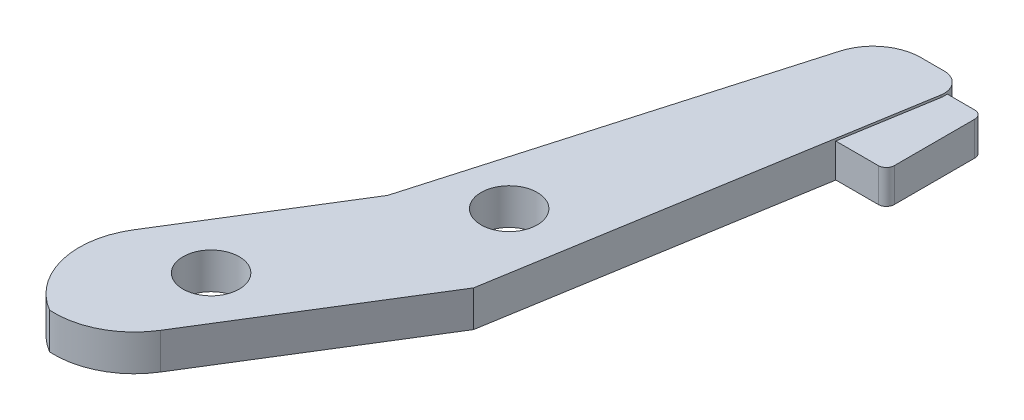
ISO-10303-21;
HEADER;
FILE_DESCRIPTION(('STEP AP214'),'2;1');
FILE_NAME('part.step','',(''),(''),'','','');
FILE_SCHEMA(('AUTOMOTIVE_DESIGN { 1 0 10303 214 1 1 1 1 }'));
ENDSEC;
DATA;
#1=APPLICATION_CONTEXT('core data for automotive mechanical design processes');
#2=APPLICATION_PROTOCOL_DEFINITION('international standard','automotive_design',2000,#1);
#3=PRODUCT_CONTEXT('',#1,'mechanical');
#4=PRODUCT('Part','Part','',(#3));
#5=PRODUCT_RELATED_PRODUCT_CATEGORY('part','',(#4));
#6=PRODUCT_DEFINITION_FORMATION('','',#4);
#7=PRODUCT_DEFINITION_CONTEXT('part definition',#1,'design');
#8=PRODUCT_DEFINITION('design','',#6,#7);
#9=PRODUCT_DEFINITION_SHAPE('','',#8);
#10=(LENGTH_UNIT() NAMED_UNIT(*) SI_UNIT(.MILLI.,.METRE.));
#11=(NAMED_UNIT(*) PLANE_ANGLE_UNIT() SI_UNIT($,.RADIAN.));
#12=(NAMED_UNIT(*) SI_UNIT($,.STERADIAN.) SOLID_ANGLE_UNIT());
#13=UNCERTAINTY_MEASURE_WITH_UNIT(LENGTH_MEASURE(1.E-05),#10,'distance_accuracy_value','');
#14=(GEOMETRIC_REPRESENTATION_CONTEXT(3) GLOBAL_UNCERTAINTY_ASSIGNED_CONTEXT((#13)) GLOBAL_UNIT_ASSIGNED_CONTEXT((#10,
#11,#12)) REPRESENTATION_CONTEXT('',''));
#15=CARTESIAN_POINT('',(0.,0.,0.));
#16=DIRECTION('',(0.,0.,1.));
#17=DIRECTION('',(1.,0.,0.));
#18=AXIS2_PLACEMENT_3D('',#15,#16,#17);
#19=CARTESIAN_POINT('',(17.140904696747,2.25,-12.9920484404567));
#20=DIRECTION('',(-0.85003009663462,0.,-0.526734121559767));
#21=DIRECTION('',(-0.526734121559767,0.,0.85003009663462));
#22=AXIS2_PLACEMENT_3D('',#19,#20,#21);
#23=PLANE('',#22);
#24=DIRECTION('',(0.526734121559767,0.,-0.85003009663462));
#25=VECTOR('',#24,1.);
#26=CARTESIAN_POINT('',(17.140904696747,2.25,-12.9920484404567));
#27=LINE('',#26,#25);
#28=CARTESIAN_POINT('',(9.68009535494014,2.25,-0.951984533055313));
#29=VERTEX_POINT('',#28);
#30=CARTESIAN_POINT('',(17.140904696747,2.25,-12.9920484404567));
#31=VERTEX_POINT('',#30);
#32=EDGE_CURVE('E188',#29,#31,#27,.T.);
#33=ORIENTED_EDGE('',*,*,#32,.F.);
#34=DIRECTION('',(0.,-1.,0.));
#35=VECTOR('',#34,1.);
#36=CARTESIAN_POINT('',(9.68009535494014,2.25,-0.951984533055313));
#37=LINE('',#36,#35);
#38=CARTESIAN_POINT('',(9.68009535494014,0.,-0.951984533055313));
#39=VERTEX_POINT('',#38);
#40=EDGE_CURVE('E217',#29,#39,#37,.T.);
#41=ORIENTED_EDGE('',*,*,#40,.T.);
#42=DIRECTION('',(0.526734121559767,0.,-0.85003009663462));
#43=VECTOR('',#42,1.);
#44=CARTESIAN_POINT('',(17.140904696747,0.,-12.9920484404567));
#45=LINE('',#44,#43);
#46=CARTESIAN_POINT('',(17.140904696747,0.,-12.9920484404567));
#47=VERTEX_POINT('',#46);
#48=EDGE_CURVE('E202',#39,#47,#45,.T.);
#49=ORIENTED_EDGE('',*,*,#48,.T.);
#50=DIRECTION('',(0.,-1.,0.));
#51=VECTOR('',#50,1.);
#52=CARTESIAN_POINT('',(17.140904696747,2.25,-12.9920484404567));
#53=LINE('',#52,#51);
#54=EDGE_CURVE('E214',#31,#47,#53,.T.);
#55=ORIENTED_EDGE('',*,*,#54,.F.);
#56=EDGE_LOOP('',(#33,#41,#49,#55));
#57=FACE_BOUND('',#56,.T.);
#58=ADVANCED_FACE('F33',(#57),#23,.F.);
#59=CARTESIAN_POINT('',(17.140904696747,2.25,-12.9920484404567));
#60=DIRECTION('',(-0.986470372828979,0.,-0.163939633800539));
#61=DIRECTION('',(-0.163939633800539,0.,0.986470372828979));
#62=AXIS2_PLACEMENT_3D('',#59,#60,#61);
#63=PLANE('',#62);
#64=DIRECTION('',(0.163939633800539,0.,-0.986470372828979));
#65=VECTOR('',#64,1.);
#66=CARTESIAN_POINT('',(17.140904696747,0.,-12.9920484404567));
#67=LINE('',#66,#65);
#68=CARTESIAN_POINT('',(21.284682724724,0.,-37.92631333672));
#69=VERTEX_POINT('',#68);
#70=EDGE_CURVE('E204',#47,#69,#67,.T.);
#71=ORIENTED_EDGE('',*,*,#70,.T.);
#72=DIRECTION('',(0.,-1.,0.));
#73=VECTOR('',#72,1.);
#74=CARTESIAN_POINT('',(21.284682724724,2.25,-37.92631333672));
#75=LINE('',#74,#73);
#76=CARTESIAN_POINT('',(21.284682724724,0.00721704735230167,-37.92631333672));
#77=VERTEX_POINT('',#76);
#78=EDGE_CURVE('E250',#69,#77,#75,.F.);
#79=ORIENTED_EDGE('',*,*,#78,.T.);
#80=DIRECTION('',(0.163939633800539,0.,-0.986470372828979));
#81=VECTOR('',#80,1.);
#82=CARTESIAN_POINT('',(21.1641785698379,0.00721704735230167,-37.201206321155));
#83=LINE('',#82,#81);
#84=CARTESIAN_POINT('',(20.3524700800733,0.00721704735230167,-32.3169305791417));
#85=VERTEX_POINT('',#84);
#86=EDGE_CURVE('E164',#85,#77,#83,.T.);
#87=ORIENTED_EDGE('',*,*,#86,.F.);
#88=DIRECTION('',(0.,-1.,0.));
#89=VECTOR('',#88,1.);
#90=CARTESIAN_POINT('',(20.3524700800733,2.1072170473523,-32.3169305791417));
#91=LINE('',#90,#89);
#92=CARTESIAN_POINT('',(20.3524700800733,2.1072170473523,-32.3169305791417));
#93=VERTEX_POINT('',#92);
#94=EDGE_CURVE('E158',#93,#85,#91,.T.);
#95=ORIENTED_EDGE('',*,*,#94,.F.);
#96=DIRECTION('',(-0.163939633800539,0.,0.986470372828979));
#97=VECTOR('',#96,1.);
#98=CARTESIAN_POINT('',(21.1641785698379,2.1072170473523,-37.201206321155));
#99=LINE('',#98,#97);
#100=CARTESIAN_POINT('',(21.284682724724,2.1072170473523,-37.92631333672));
#101=VERTEX_POINT('',#100);
#102=EDGE_CURVE('E145',#101,#93,#99,.T.);
#103=ORIENTED_EDGE('',*,*,#102,.F.);
#104=DIRECTION('',(0.,-1.,0.));
#105=VECTOR('',#104,1.);
#106=CARTESIAN_POINT('',(21.284682724724,2.25,-37.92631333672));
#107=LINE('',#106,#105);
#108=CARTESIAN_POINT('',(21.284682724724,2.25,-37.92631333672));
#109=VERTEX_POINT('',#108);
#110=EDGE_CURVE('E248',#101,#109,#107,.F.);
#111=ORIENTED_EDGE('',*,*,#110,.T.);
#112=DIRECTION('',(0.163939633800539,0.,-0.986470372828979));
#113=VECTOR('',#112,1.);
#114=CARTESIAN_POINT('',(17.140904696747,2.25,-12.9920484404567));
#115=LINE('',#114,#113);
#116=EDGE_CURVE('E190',#31,#109,#115,.T.);
#117=ORIENTED_EDGE('',*,*,#116,.F.);
#118=ORIENTED_EDGE('',*,*,#54,.T.);
#119=EDGE_LOOP('',(#71,#79,#87,#95,#103,#111,#117,#118));
#120=FACE_BOUND('',#119,.T.);
#121=ADVANCED_FACE('F162',(#120),#63,.F.);
#122=CARTESIAN_POINT('',(21.5168022197482,2.25,-39.3230408972806));
#123=DIRECTION('',(0.,0.,1.));
#124=DIRECTION('',(1.,0.,0.));
#125=AXIS2_PLACEMENT_3D('',#122,#123,#124);
#126=PLANE('',#125);
#127=DIRECTION('',(-1.,0.,0.));
#128=VECTOR('',#127,1.);
#129=CARTESIAN_POINT('',(21.5168022197482,2.25,-39.3230408972806));
#130=LINE('',#129,#128);
#131=CARTESIAN_POINT('',(20.1009182773292,2.25,-39.3230408972806));
#132=VERTEX_POINT('',#131);
#133=CARTESIAN_POINT('',(18.6611922487619,2.25,-39.3230408972806));
#134=VERTEX_POINT('',#133);
#135=EDGE_CURVE('E194',#132,#134,#130,.T.);
#136=ORIENTED_EDGE('',*,*,#135,.F.);
#137=DIRECTION('',(0.,-1.,0.));
#138=VECTOR('',#137,1.);
#139=CARTESIAN_POINT('',(20.1009182773292,2.25,-39.3230408972806));
#140=LINE('',#139,#138);
#141=CARTESIAN_POINT('',(20.1009182773292,0.,-39.3230408972806));
#142=VERTEX_POINT('',#141);
#143=EDGE_CURVE('E243',#132,#142,#140,.T.);
#144=ORIENTED_EDGE('',*,*,#143,.T.);
#145=DIRECTION('',(-1.,0.,0.));
#146=VECTOR('',#145,1.);
#147=CARTESIAN_POINT('',(21.5168022197482,0.,-39.3230408972806));
#148=LINE('',#147,#146);
#149=CARTESIAN_POINT('',(18.6611922487619,0.,-39.3230408972806));
#150=VERTEX_POINT('',#149);
#151=EDGE_CURVE('E206',#142,#150,#148,.T.);
#152=ORIENTED_EDGE('',*,*,#151,.T.);
#153=DIRECTION('',(0.,-1.,0.));
#154=VECTOR('',#153,1.);
#155=CARTESIAN_POINT('',(18.6611922487619,2.25,-39.3230408972806));
#156=LINE('',#155,#154);
#157=EDGE_CURVE('E238',#150,#134,#156,.F.);
#158=ORIENTED_EDGE('',*,*,#157,.T.);
#159=EDGE_LOOP('',(#136,#144,#152,#158));
#160=FACE_BOUND('',#159,.T.);
#161=ADVANCED_FACE('F313',(#160),#126,.F.);
#162=CARTESIAN_POINT('',(9.48121418807581,2.25,-15.3005417394231));
#163=DIRECTION('',(0.960899966314299,0.,0.276895747055058));
#164=DIRECTION('',(0.276895747055058,0.,-0.960899966314299));
#165=AXIS2_PLACEMENT_3D('',#162,#163,#164);
#166=PLANE('',#165);
#167=DIRECTION('',(-0.276895747055058,0.,0.960899966314299));
#168=VECTOR('',#167,1.);
#169=CARTESIAN_POINT('',(9.48121418807581,2.25,-15.3005417394231));
#170=LINE('',#169,#168);
#171=CARTESIAN_POINT('',(15.778492349819,2.25,-37.1537281384458));
#172=VERTEX_POINT('',#171);
#173=CARTESIAN_POINT('',(9.48121418807581,2.25,-15.3005417394231));
#174=VERTEX_POINT('',#173);
#175=EDGE_CURVE('E196',#172,#174,#170,.T.);
#176=ORIENTED_EDGE('',*,*,#175,.F.);
#177=DIRECTION('',(0.,-1.,0.));
#178=VECTOR('',#177,1.);
#179=CARTESIAN_POINT('',(15.778492349819,2.25,-37.1537281384458));
#180=LINE('',#179,#178);
#181=CARTESIAN_POINT('',(15.778492349819,0.,-37.1537281384458));
#182=VERTEX_POINT('',#181);
#183=EDGE_CURVE('E230',#172,#182,#180,.T.);
#184=ORIENTED_EDGE('',*,*,#183,.T.);
#185=DIRECTION('',(-0.276895747055058,0.,0.960899966314299));
#186=VECTOR('',#185,1.);
#187=CARTESIAN_POINT('',(9.48121418807581,0.,-15.3005417394231));
#188=LINE('',#187,#186);
#189=CARTESIAN_POINT('',(9.48121418807581,0.,-15.3005417394231));
#190=VERTEX_POINT('',#189);
#191=EDGE_CURVE('E208',#182,#190,#188,.T.);
#192=ORIENTED_EDGE('',*,*,#191,.T.);
#193=DIRECTION('',(0.,-1.,0.));
#194=VECTOR('',#193,1.);
#195=CARTESIAN_POINT('',(9.48121418807581,2.25,-15.3005417394231));
#196=LINE('',#195,#194);
#197=EDGE_CURVE('E201',#174,#190,#196,.T.);
#198=ORIENTED_EDGE('',*,*,#197,.F.);
#199=EDGE_LOOP('',(#176,#184,#192,#198));
#200=FACE_BOUND('',#199,.T.);
#201=ADVANCED_FACE('F321',(#200),#166,.F.);
#202=CARTESIAN_POINT('',(0.,2.25,0.));
#203=DIRECTION('',(0.850030096634619,0.,0.526734121559767));
#204=DIRECTION('',(0.526734121559767,0.,-0.850030096634619));
#205=AXIS2_PLACEMENT_3D('',#202,#203,#204);
#206=PLANE('',#205);
#207=DIRECTION('',(-0.526734121559767,0.,0.850030096634619));
#208=VECTOR('',#207,1.);
#209=CARTESIAN_POINT('',(0.,0.,0.));
#210=LINE('',#209,#208);
#211=CARTESIAN_POINT('',(3.43308465290625,0.,-5.54022448863435));
#212=VERTEX_POINT('',#211);
#213=EDGE_CURVE('E191',#190,#212,#210,.T.);
#214=ORIENTED_EDGE('',*,*,#213,.T.);
#215=DIRECTION('',(0.,-1.,0.));
#216=VECTOR('',#215,1.);
#217=CARTESIAN_POINT('',(3.43308465290625,2.25,-5.54022448863435));
#218=LINE('',#217,#216);
#219=CARTESIAN_POINT('',(3.43308465290625,2.25,-5.54022448863435));
#220=VERTEX_POINT('',#219);
#221=EDGE_CURVE('E228',#212,#220,#218,.F.);
#222=ORIENTED_EDGE('',*,*,#221,.T.);
#223=DIRECTION('',(-0.526734121559767,0.,0.850030096634619));
#224=VECTOR('',#223,1.);
#225=CARTESIAN_POINT('',(0.,2.25,0.));
#226=LINE('',#225,#224);
#227=EDGE_CURVE('E198',#174,#220,#226,.T.);
#228=ORIENTED_EDGE('',*,*,#227,.F.);
#229=ORIENTED_EDGE('',*,*,#197,.T.);
#230=EDGE_LOOP('',(#214,#222,#228,#229));
#231=FACE_BOUND('',#230,.T.);
#232=ADVANCED_FACE('F327',(#231),#206,.F.);
#233=CARTESIAN_POINT('',(0.,2.25,0.));
#234=DIRECTION('',(0.,-1.,0.));
#235=DIRECTION('',(0.,0.,-1.));
#236=AXIS2_PLACEMENT_3D('',#233,#234,#235);
#237=PLANE('',#236);
#238=CARTESIAN_POINT('',(8.16721187147033,2.25,-5.62987306447002));
#239=DIRECTION('',(0.,1.,0.));
#240=DIRECTION('',(0.,0.,1.));
#241=AXIS2_PLACEMENT_3D('',#238,#239,#240);
#242=CIRCLE('',#241,1.75);
#243=CARTESIAN_POINT('',(8.16721187147033,2.25,-3.87987306447002));
#244=VERTEX_POINT('',#243);
#245=EDGE_CURVE('E180',#244,#244,#242,.T.);
#246=ORIENTED_EDGE('',*,*,#245,.F.);
#247=EDGE_LOOP('',(#246));
#248=FACE_BOUND('',#247,.T.);
#249=CARTESIAN_POINT('',(13.9792075582931,2.25,-18.3664623306885));
#250=DIRECTION('',(0.,1.,0.));
#251=DIRECTION('',(0.,0.,1.));
#252=AXIS2_PLACEMENT_3D('',#249,#250,#251);
#253=CIRCLE('',#252,1.75);
#254=CARTESIAN_POINT('',(13.9792075582931,2.25,-16.6164623306885));
#255=VERTEX_POINT('',#254);
#256=EDGE_CURVE('E175',#255,#255,#253,.T.);
#257=ORIENTED_EDGE('',*,*,#256,.F.);
#258=EDGE_LOOP('',(#257));
#259=FACE_BOUND('',#258,.T.);
#260=ORIENTED_EDGE('',*,*,#116,.T.);
#261=CARTESIAN_POINT('',(20.1009182773292,2.25,-38.1230408972806));
#262=DIRECTION('',(0.,-1.,0.));
#263=DIRECTION('',(0.,0.,-1.));
#264=AXIS2_PLACEMENT_3D('',#261,#262,#263);
#265=CIRCLE('',#264,1.2);
#266=EDGE_CURVE('E252',#109,#132,#265,.F.);
#267=ORIENTED_EDGE('',*,*,#266,.T.);
#268=ORIENTED_EDGE('',*,*,#135,.T.);
#269=CARTESIAN_POINT('',(18.6611922487619,2.25,-36.3230408972806));
#270=DIRECTION('',(0.,-1.,0.));
#271=DIRECTION('',(0.,0.,-1.));
#272=AXIS2_PLACEMENT_3D('',#269,#270,#271);
#273=CIRCLE('',#272,3.);
#274=EDGE_CURVE('E241',#134,#172,#273,.F.);
#275=ORIENTED_EDGE('',*,*,#274,.T.);
#276=ORIENTED_EDGE('',*,*,#175,.T.);
#277=ORIENTED_EDGE('',*,*,#227,.T.);
#278=CARTESIAN_POINT('',(7.68323513607934,2.25,-2.90655388083552));
#279=DIRECTION('',(0.,-1.,0.));
#280=DIRECTION('',(0.,0.,-1.));
#281=AXIS2_PLACEMENT_3D('',#278,#279,#280);
#282=CIRCLE('',#281,5.);
#283=CARTESIAN_POINT('',(5.15430572660444,2.25,1.40674138402787));
#284=VERTEX_POINT('',#283);
#285=EDGE_CURVE('E224',#220,#284,#282,.F.);
#286=ORIENTED_EDGE('',*,*,#285,.T.);
#287=CARTESIAN_POINT('',(5.42994487176705,2.25,-3.58565514085415));
#288=DIRECTION('',(0.,-1.,0.));
#289=DIRECTION('',(0.,0.,-1.));
#290=AXIS2_PLACEMENT_3D('',#287,#288,#289);
#291=CIRCLE('',#290,5.);
#292=EDGE_CURVE('E226',#284,#29,#291,.F.);
#293=ORIENTED_EDGE('',*,*,#292,.T.);
#294=ORIENTED_EDGE('',*,*,#32,.T.);
#295=EDGE_LOOP('',(#260,#267,#268,#275,#276,#277,#286,#293,#294));
#296=FACE_BOUND('',#295,.T.);
#297=ADVANCED_FACE('F300',(#248,#259,#296),#237,.F.);
#298=CARTESIAN_POINT('',(0.,0.,0.));
#299=DIRECTION('',(0.,-1.,0.));
#300=DIRECTION('',(0.,0.,-1.));
#301=AXIS2_PLACEMENT_3D('',#298,#299,#300);
#302=PLANE('',#301);
#303=CARTESIAN_POINT('',(8.16721187147033,0.,-5.62987306447002));
#304=DIRECTION('',(0.,1.,0.));
#305=DIRECTION('',(0.,0.,1.));
#306=AXIS2_PLACEMENT_3D('',#303,#304,#305);
#307=CIRCLE('',#306,1.75);
#308=CARTESIAN_POINT('',(8.16721187147033,0.,-3.87987306447002));
#309=VERTEX_POINT('',#308);
#310=EDGE_CURVE('E176',#309,#309,#307,.T.);
#311=ORIENTED_EDGE('',*,*,#310,.T.);
#312=EDGE_LOOP('',(#311));
#313=FACE_BOUND('',#312,.T.);
#314=CARTESIAN_POINT('',(13.9792075582931,0.,-18.3664623306885));
#315=DIRECTION('',(0.,1.,0.));
#316=DIRECTION('',(0.,0.,1.));
#317=AXIS2_PLACEMENT_3D('',#314,#315,#316);
#318=CIRCLE('',#317,1.75);
#319=CARTESIAN_POINT('',(13.9792075582931,0.,-16.6164623306885));
#320=VERTEX_POINT('',#319);
#321=EDGE_CURVE('E183',#320,#320,#318,.T.);
#322=ORIENTED_EDGE('',*,*,#321,.T.);
#323=EDGE_LOOP('',(#322));
#324=FACE_BOUND('',#323,.T.);
#325=ORIENTED_EDGE('',*,*,#151,.F.);
#326=CARTESIAN_POINT('',(20.1009182773292,0.,-38.1230408972806));
#327=DIRECTION('',(0.,-1.,0.));
#328=DIRECTION('',(0.,0.,-1.));
#329=AXIS2_PLACEMENT_3D('',#326,#327,#328);
#330=CIRCLE('',#329,1.2);
#331=EDGE_CURVE('E246',#142,#69,#330,.T.);
#332=ORIENTED_EDGE('',*,*,#331,.T.);
#333=ORIENTED_EDGE('',*,*,#70,.F.);
#334=ORIENTED_EDGE('',*,*,#48,.F.);
#335=CARTESIAN_POINT('',(5.42994487176705,0.,-3.58565514085415));
#336=DIRECTION('',(0.,-1.,0.));
#337=DIRECTION('',(0.,0.,-1.));
#338=AXIS2_PLACEMENT_3D('',#335,#336,#337);
#339=CIRCLE('',#338,5.);
#340=CARTESIAN_POINT('',(5.15430572660444,0.,1.40674138402787));
#341=VERTEX_POINT('',#340);
#342=EDGE_CURVE('E222',#39,#341,#339,.T.);
#343=ORIENTED_EDGE('',*,*,#342,.T.);
#344=CARTESIAN_POINT('',(7.68323513607934,0.,-2.90655388083552));
#345=DIRECTION('',(0.,-1.,0.));
#346=DIRECTION('',(0.,0.,-1.));
#347=AXIS2_PLACEMENT_3D('',#344,#345,#346);
#348=CIRCLE('',#347,5.);
#349=EDGE_CURVE('E220',#341,#212,#348,.T.);
#350=ORIENTED_EDGE('',*,*,#349,.T.);
#351=ORIENTED_EDGE('',*,*,#213,.F.);
#352=ORIENTED_EDGE('',*,*,#191,.F.);
#353=CARTESIAN_POINT('',(18.6611922487619,0.,-36.3230408972806));
#354=DIRECTION('',(0.,-1.,0.));
#355=DIRECTION('',(0.,0.,-1.));
#356=AXIS2_PLACEMENT_3D('',#353,#354,#355);
#357=CIRCLE('',#356,3.);
#358=EDGE_CURVE('E235',#182,#150,#357,.T.);
#359=ORIENTED_EDGE('',*,*,#358,.T.);
#360=EDGE_LOOP('',(#325,#332,#333,#334,#343,#350,#351,#352,#359));
#361=FACE_BOUND('',#360,.T.);
#362=ADVANCED_FACE('F311',(#313,#324,#361),#302,.T.);
#363=CARTESIAN_POINT('',(7.68323513607934,2.25,-2.90655388083552));
#364=DIRECTION('',(0.,-1.,0.));
#365=DIRECTION('',(0.,0.,-1.));
#366=AXIS2_PLACEMENT_3D('',#363,#364,#365);
#367=CYLINDRICAL_SURFACE('',#366,5.);
#368=DIRECTION('',(0.,-1.,0.));
#369=VECTOR('',#368,1.);
#370=CARTESIAN_POINT('',(5.15430572660444,1.125,1.40674138402787));
#371=LINE('',#370,#369);
#372=EDGE_CURVE('E179',#284,#341,#371,.T.);
#373=ORIENTED_EDGE('',*,*,#372,.F.);
#374=ORIENTED_EDGE('',*,*,#285,.F.);
#375=ORIENTED_EDGE('',*,*,#221,.F.);
#376=ORIENTED_EDGE('',*,*,#349,.F.);
#377=EDGE_LOOP('',(#373,#374,#375,#376));
#378=FACE_BOUND('',#377,.T.);
#379=ADVANCED_FACE('F332',(#378),#367,.T.);
#380=CARTESIAN_POINT('',(5.42994487176705,2.25,-3.58565514085415));
#381=DIRECTION('',(0.,-1.,0.));
#382=DIRECTION('',(0.,0.,-1.));
#383=AXIS2_PLACEMENT_3D('',#380,#381,#382);
#384=CYLINDRICAL_SURFACE('',#383,5.);
#385=ORIENTED_EDGE('',*,*,#292,.F.);
#386=ORIENTED_EDGE('',*,*,#372,.T.);
#387=ORIENTED_EDGE('',*,*,#342,.F.);
#388=ORIENTED_EDGE('',*,*,#40,.F.);
#389=EDGE_LOOP('',(#385,#386,#387,#388));
#390=FACE_BOUND('',#389,.T.);
#391=ADVANCED_FACE('F335',(#390),#384,.T.);
#392=CARTESIAN_POINT('',(13.9792075582931,0.,-18.3664623306885));
#393=DIRECTION('',(0.,1.,0.));
#394=DIRECTION('',(0.,0.,1.));
#395=AXIS2_PLACEMENT_3D('',#392,#393,#394);
#396=CYLINDRICAL_SURFACE('',#395,1.75);
#397=ORIENTED_EDGE('',*,*,#321,.F.);
#398=EDGE_LOOP('',(#397));
#399=FACE_BOUND('',#398,.T.);
#400=ORIENTED_EDGE('',*,*,#256,.T.);
#401=EDGE_LOOP('',(#400));
#402=FACE_BOUND('',#401,.T.);
#403=ADVANCED_FACE('F337',(#399,#402),#396,.F.);
#404=CARTESIAN_POINT('',(8.16721187147033,0.,-5.62987306447002));
#405=DIRECTION('',(0.,1.,0.));
#406=DIRECTION('',(0.,0.,1.));
#407=AXIS2_PLACEMENT_3D('',#404,#405,#406);
#408=CYLINDRICAL_SURFACE('',#407,1.75);
#409=ORIENTED_EDGE('',*,*,#310,.F.);
#410=EDGE_LOOP('',(#409));
#411=FACE_BOUND('',#410,.T.);
#412=ORIENTED_EDGE('',*,*,#245,.T.);
#413=EDGE_LOOP('',(#412));
#414=FACE_BOUND('',#413,.T.);
#415=ADVANCED_FACE('F343',(#411,#414),#408,.F.);
#416=CARTESIAN_POINT('',(23.5,0.,0.));
#417=DIRECTION('',(-1.,0.,0.));
#418=DIRECTION('',(0.,0.,1.));
#419=AXIS2_PLACEMENT_3D('',#416,#417,#418);
#420=PLANE('',#419);
#421=DIRECTION('',(0.,0.,1.));
#422=VECTOR('',#421,1.);
#423=CARTESIAN_POINT('',(23.5,2.1072170473523,-38.3169305791417));
#424=LINE('',#423,#422);
#425=CARTESIAN_POINT('',(23.5,2.1072170473523,-37.8169305791417));
#426=VERTEX_POINT('',#425);
#427=CARTESIAN_POINT('',(23.5,2.1072170473523,-32.8169305791417));
#428=VERTEX_POINT('',#427);
#429=EDGE_CURVE('E273',#426,#428,#424,.T.);
#430=ORIENTED_EDGE('',*,*,#429,.T.);
#431=DIRECTION('',(0.,-1.,0.));
#432=VECTOR('',#431,1.);
#433=CARTESIAN_POINT('',(23.5,0.00721704735230167,-32.8169305791417));
#434=LINE('',#433,#432);
#435=CARTESIAN_POINT('',(23.5,0.00721704735230167,-32.8169305791417));
#436=VERTEX_POINT('',#435);
#437=EDGE_CURVE('E264',#428,#436,#434,.T.);
#438=ORIENTED_EDGE('',*,*,#437,.T.);
#439=DIRECTION('',(0.,0.,-1.));
#440=VECTOR('',#439,1.);
#441=CARTESIAN_POINT('',(23.5,0.00721704735230167,-38.3169305791417));
#442=LINE('',#441,#440);
#443=CARTESIAN_POINT('',(23.5,0.00721704735230167,-37.8169305791417));
#444=VERTEX_POINT('',#443);
#445=EDGE_CURVE('E154',#436,#444,#442,.T.);
#446=ORIENTED_EDGE('',*,*,#445,.T.);
#447=DIRECTION('',(0.,1.,0.));
#448=VECTOR('',#447,1.);
#449=CARTESIAN_POINT('',(23.5,2.1072170473523,-37.8169305791417));
#450=LINE('',#449,#448);
#451=EDGE_CURVE('E261',#444,#426,#450,.T.);
#452=ORIENTED_EDGE('',*,*,#451,.T.);
#453=EDGE_LOOP('',(#430,#438,#446,#452));
#454=FACE_BOUND('',#453,.T.);
#455=ADVANCED_FACE('F277',(#454),#420,.F.);
#456=CARTESIAN_POINT('',(14.4505553950443,2.1072170473523,-38.3169305791417));
#457=DIRECTION('',(0.,1.,0.));
#458=DIRECTION('',(0.,0.,1.));
#459=AXIS2_PLACEMENT_3D('',#456,#457,#458);
#460=PLANE('',#459);
#461=DIRECTION('',(1.,0.,0.));
#462=VECTOR('',#461,1.);
#463=CARTESIAN_POINT('',(14.4505553950443,2.1072170473523,-32.3169305791417));
#464=LINE('',#463,#462);
#465=CARTESIAN_POINT('',(23.,2.1072170473523,-32.3169305791417));
#466=VERTEX_POINT('',#465);
#467=EDGE_CURVE('E147',#93,#466,#464,.T.);
#468=ORIENTED_EDGE('',*,*,#467,.T.);
#469=CARTESIAN_POINT('',(23.,2.1072170473523,-32.8169305791417));
#470=DIRECTION('',(0.,1.,0.));
#471=DIRECTION('',(0.,0.,1.));
#472=AXIS2_PLACEMENT_3D('',#469,#470,#471);
#473=CIRCLE('',#472,0.5);
#474=EDGE_CURVE('E41',#466,#428,#473,.T.);
#475=ORIENTED_EDGE('',*,*,#474,.T.);
#476=ORIENTED_EDGE('',*,*,#429,.F.);
#477=CARTESIAN_POINT('',(23.,2.1072170473523,-37.8169305791417));
#478=DIRECTION('',(0.,1.,0.));
#479=DIRECTION('',(0.,0.,1.));
#480=AXIS2_PLACEMENT_3D('',#477,#478,#479);
#481=CIRCLE('',#480,0.5);
#482=CARTESIAN_POINT('',(23.,2.1072170473523,-38.3169305791417));
#483=VERTEX_POINT('',#482);
#484=EDGE_CURVE('E48',#426,#483,#481,.T.);
#485=ORIENTED_EDGE('',*,*,#484,.T.);
#486=DIRECTION('',(1.,0.,0.));
#487=VECTOR('',#486,1.);
#488=CARTESIAN_POINT('',(14.4505553950443,2.1072170473523,-38.3169305791417));
#489=LINE('',#488,#487);
#490=CARTESIAN_POINT('',(21.2851508521505,2.1072170473523,-38.3169305791417));
#491=VERTEX_POINT('',#490);
#492=EDGE_CURVE('E172',#491,#483,#489,.T.);
#493=ORIENTED_EDGE('',*,*,#492,.F.);
#494=CARTESIAN_POINT('',(20.1009182773292,2.1072170473523,-38.1230408972806));
#495=DIRECTION('',(0.,1.,0.));
#496=DIRECTION('',(0.,0.,1.));
#497=AXIS2_PLACEMENT_3D('',#494,#495,#496);
#498=CIRCLE('',#497,1.2);
#499=EDGE_CURVE('E150',#491,#101,#498,.F.);
#500=ORIENTED_EDGE('',*,*,#499,.T.);
#501=ORIENTED_EDGE('',*,*,#102,.T.);
#502=EDGE_LOOP('',(#468,#475,#476,#485,#493,#500,#501));
#503=FACE_BOUND('',#502,.T.);
#504=ADVANCED_FACE('F146',(#503),#460,.T.);
#505=CARTESIAN_POINT('',(14.4505553950443,2.1072170473523,-32.3169305791417));
#506=DIRECTION('',(0.,0.,1.));
#507=DIRECTION('',(1.,0.,0.));
#508=AXIS2_PLACEMENT_3D('',#505,#506,#507);
#509=PLANE('',#508);
#510=DIRECTION('',(1.,0.,0.));
#511=VECTOR('',#510,1.);
#512=CARTESIAN_POINT('',(14.4505553950443,0.00721704735230167,-32.3169305791417));
#513=LINE('',#512,#511);
#514=CARTESIAN_POINT('',(23.,0.00721704735230167,-32.3169305791417));
#515=VERTEX_POINT('',#514);
#516=EDGE_CURVE('E165',#85,#515,#513,.T.);
#517=ORIENTED_EDGE('',*,*,#516,.T.);
#518=DIRECTION('',(0.,-1.,0.));
#519=VECTOR('',#518,1.);
#520=CARTESIAN_POINT('',(23.,2.1072170473523,-32.3169305791417));
#521=LINE('',#520,#519);
#522=EDGE_CURVE('E56',#515,#466,#521,.F.);
#523=ORIENTED_EDGE('',*,*,#522,.T.);
#524=ORIENTED_EDGE('',*,*,#467,.F.);
#525=ORIENTED_EDGE('',*,*,#94,.T.);
#526=EDGE_LOOP('',(#517,#523,#524,#525));
#527=FACE_BOUND('',#526,.T.);
#528=ADVANCED_FACE('F157',(#527),#509,.T.);
#529=CARTESIAN_POINT('',(14.4505553950443,0.00721704735230167,-38.3169305791417));
#530=DIRECTION('',(0.,-1.,0.));
#531=DIRECTION('',(0.,0.,-1.));
#532=AXIS2_PLACEMENT_3D('',#529,#530,#531);
#533=PLANE('',#532);
#534=ORIENTED_EDGE('',*,*,#445,.F.);
#535=CARTESIAN_POINT('',(23.,0.00721704735230167,-32.8169305791417));
#536=DIRECTION('',(0.,-1.,0.));
#537=DIRECTION('',(0.,0.,-1.));
#538=AXIS2_PLACEMENT_3D('',#535,#536,#537);
#539=CIRCLE('',#538,0.5);
#540=EDGE_CURVE('E269',#436,#515,#539,.T.);
#541=ORIENTED_EDGE('',*,*,#540,.T.);
#542=ORIENTED_EDGE('',*,*,#516,.F.);
#543=ORIENTED_EDGE('',*,*,#86,.T.);
#544=CARTESIAN_POINT('',(20.1009182773292,0.00721704735230167,-38.1230408972806));
#545=DIRECTION('',(0.,-1.,0.));
#546=DIRECTION('',(0.,0.,-1.));
#547=AXIS2_PLACEMENT_3D('',#544,#545,#546);
#548=CIRCLE('',#547,1.2);
#549=CARTESIAN_POINT('',(21.2851508521505,0.00721704735230167,-38.3169305791417));
#550=VERTEX_POINT('',#549);
#551=EDGE_CURVE('E254',#77,#550,#548,.F.);
#552=ORIENTED_EDGE('',*,*,#551,.T.);
#553=DIRECTION('',(1.,0.,0.));
#554=VECTOR('',#553,1.);
#555=CARTESIAN_POINT('',(14.4505553950443,0.00721704735230167,-38.3169305791417));
#556=LINE('',#555,#554);
#557=CARTESIAN_POINT('',(23.,0.00721704735230167,-38.3169305791417));
#558=VERTEX_POINT('',#557);
#559=EDGE_CURVE('E170',#550,#558,#556,.T.);
#560=ORIENTED_EDGE('',*,*,#559,.T.);
#561=CARTESIAN_POINT('',(23.,0.00721704735230167,-37.8169305791417));
#562=DIRECTION('',(0.,-1.,0.));
#563=DIRECTION('',(0.,0.,-1.));
#564=AXIS2_PLACEMENT_3D('',#561,#562,#563);
#565=CIRCLE('',#564,0.5);
#566=EDGE_CURVE('E267',#558,#444,#565,.T.);
#567=ORIENTED_EDGE('',*,*,#566,.T.);
#568=EDGE_LOOP('',(#534,#541,#542,#543,#552,#560,#567));
#569=FACE_BOUND('',#568,.T.);
#570=ADVANCED_FACE('F284',(#569),#533,.T.);
#571=CARTESIAN_POINT('',(14.4505553950443,2.1072170473523,-38.3169305791417));
#572=DIRECTION('',(0.,0.,-1.));
#573=DIRECTION('',(-1.,0.,0.));
#574=AXIS2_PLACEMENT_3D('',#571,#572,#573);
#575=PLANE('',#574);
#576=ORIENTED_EDGE('',*,*,#492,.T.);
#577=DIRECTION('',(0.,1.,0.));
#578=VECTOR('',#577,1.);
#579=CARTESIAN_POINT('',(23.,0.00721704735230167,-38.3169305791417));
#580=LINE('',#579,#578);
#581=EDGE_CURVE('E11',#483,#558,#580,.F.);
#582=ORIENTED_EDGE('',*,*,#581,.T.);
#583=ORIENTED_EDGE('',*,*,#559,.F.);
#584=DIRECTION('',(0.,-1.,0.));
#585=VECTOR('',#584,1.);
#586=CARTESIAN_POINT('',(21.2851508521505,0.00721704735230167,-38.3169305791417));
#587=LINE('',#586,#585);
#588=EDGE_CURVE('E257',#550,#491,#587,.F.);
#589=ORIENTED_EDGE('',*,*,#588,.T.);
#590=EDGE_LOOP('',(#576,#582,#583,#589));
#591=FACE_BOUND('',#590,.T.);
#592=ADVANCED_FACE('F290',(#591),#575,.T.);
#593=CARTESIAN_POINT('',(18.6611922487619,2.25,-36.3230408972806));
#594=DIRECTION('',(0.,-1.,0.));
#595=DIRECTION('',(0.,0.,-1.));
#596=AXIS2_PLACEMENT_3D('',#593,#594,#595);
#597=CYLINDRICAL_SURFACE('',#596,3.);
#598=ORIENTED_EDGE('',*,*,#274,.F.);
#599=ORIENTED_EDGE('',*,*,#157,.F.);
#600=ORIENTED_EDGE('',*,*,#358,.F.);
#601=ORIENTED_EDGE('',*,*,#183,.F.);
#602=EDGE_LOOP('',(#598,#599,#600,#601));
#603=FACE_BOUND('',#602,.T.);
#604=ADVANCED_FACE('F324',(#603),#597,.T.);
#605=CARTESIAN_POINT('',(20.1009182773292,2.25,-38.1230408972806));
#606=DIRECTION('',(0.,-1.,0.));
#607=DIRECTION('',(0.,0.,-1.));
#608=AXIS2_PLACEMENT_3D('',#605,#606,#607);
#609=CYLINDRICAL_SURFACE('',#608,1.2);
#610=ORIENTED_EDGE('',*,*,#551,.F.);
#611=ORIENTED_EDGE('',*,*,#78,.F.);
#612=ORIENTED_EDGE('',*,*,#331,.F.);
#613=ORIENTED_EDGE('',*,*,#143,.F.);
#614=ORIENTED_EDGE('',*,*,#266,.F.);
#615=ORIENTED_EDGE('',*,*,#110,.F.);
#616=ORIENTED_EDGE('',*,*,#499,.F.);
#617=ORIENTED_EDGE('',*,*,#588,.F.);
#618=EDGE_LOOP('',(#610,#611,#612,#613,#614,#615,#616,#617));
#619=FACE_BOUND('',#618,.T.);
#620=ADVANCED_FACE('F295',(#619),#609,.T.);
#621=CARTESIAN_POINT('',(23.,0.,-32.8169305791417));
#622=DIRECTION('',(0.,1.,0.));
#623=DIRECTION('',(0.,0.,1.));
#624=AXIS2_PLACEMENT_3D('',#621,#622,#623);
#625=CYLINDRICAL_SURFACE('',#624,0.5);
#626=ORIENTED_EDGE('',*,*,#474,.F.);
#627=ORIENTED_EDGE('',*,*,#522,.F.);
#628=ORIENTED_EDGE('',*,*,#540,.F.);
#629=ORIENTED_EDGE('',*,*,#437,.F.);
#630=EDGE_LOOP('',(#626,#627,#628,#629));
#631=FACE_BOUND('',#630,.T.);
#632=ADVANCED_FACE('F282',(#631),#625,.T.);
#633=CARTESIAN_POINT('',(23.,0.,-37.8169305791417));
#634=DIRECTION('',(0.,-1.,0.));
#635=DIRECTION('',(0.,0.,-1.));
#636=AXIS2_PLACEMENT_3D('',#633,#634,#635);
#637=CYLINDRICAL_SURFACE('',#636,0.5);
#638=ORIENTED_EDGE('',*,*,#566,.F.);
#639=ORIENTED_EDGE('',*,*,#581,.F.);
#640=ORIENTED_EDGE('',*,*,#484,.F.);
#641=ORIENTED_EDGE('',*,*,#451,.F.);
#642=EDGE_LOOP('',(#638,#639,#640,#641));
#643=FACE_BOUND('',#642,.T.);
#644=ADVANCED_FACE('F35',(#643),#637,.T.);
#645=CLOSED_SHELL('',(#58,#121,#161,#201,#232,#297,#362,#379,#391,#403,#415,#455,#504,#528,#570,
#592,#604,#620,#632,#644));
#646=MANIFOLD_SOLID_BREP('B2',#645);
#647=ADVANCED_BREP_SHAPE_REPRESENTATION('',(#18,#646),#14);
#648=SHAPE_DEFINITION_REPRESENTATION(#9,#647);
ENDSEC;
END-ISO-10303-21;
